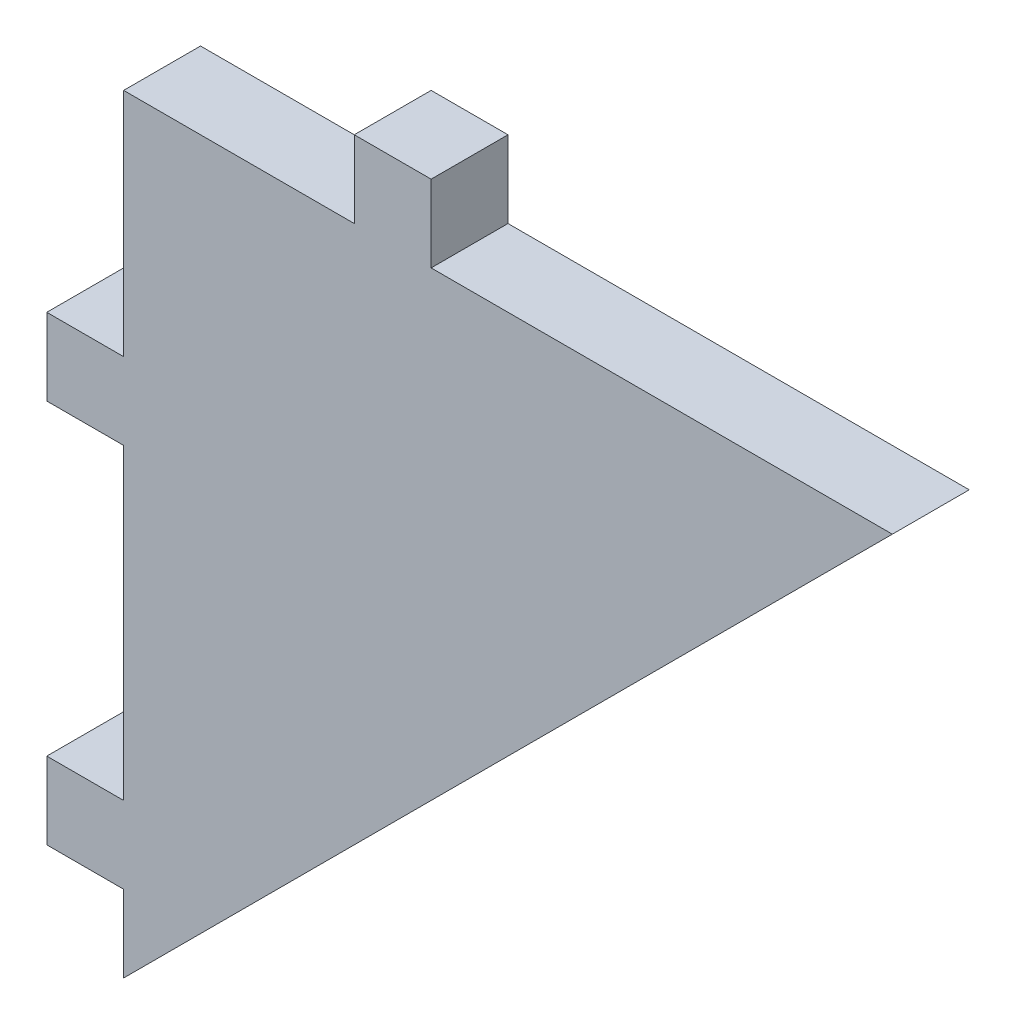
ISO-10303-21;
HEADER;
FILE_DESCRIPTION(('STEP AP214'),'2;1');
FILE_NAME('part.step','',(''),(''),'','','');
FILE_SCHEMA(('AUTOMOTIVE_DESIGN { 1 0 10303 214 1 1 1 1 }'));
ENDSEC;
DATA;
#1=APPLICATION_CONTEXT('core data for automotive mechanical design processes');
#2=APPLICATION_PROTOCOL_DEFINITION('international standard','automotive_design',2000,#1);
#3=PRODUCT_CONTEXT('',#1,'mechanical');
#4=PRODUCT('Part','Part','',(#3));
#5=PRODUCT_RELATED_PRODUCT_CATEGORY('part','',(#4));
#6=PRODUCT_DEFINITION_FORMATION('','',#4);
#7=PRODUCT_DEFINITION_CONTEXT('part definition',#1,'design');
#8=PRODUCT_DEFINITION('design','',#6,#7);
#9=PRODUCT_DEFINITION_SHAPE('','',#8);
#10=(LENGTH_UNIT() NAMED_UNIT(*) SI_UNIT(.MILLI.,.METRE.));
#11=(NAMED_UNIT(*) PLANE_ANGLE_UNIT() SI_UNIT($,.RADIAN.));
#12=(NAMED_UNIT(*) SI_UNIT($,.STERADIAN.) SOLID_ANGLE_UNIT());
#13=UNCERTAINTY_MEASURE_WITH_UNIT(LENGTH_MEASURE(1.E-05),#10,'distance_accuracy_value','');
#14=(GEOMETRIC_REPRESENTATION_CONTEXT(3) GLOBAL_UNCERTAINTY_ASSIGNED_CONTEXT((#13)) GLOBAL_UNIT_ASSIGNED_CONTEXT((#10,
#11,#12)) REPRESENTATION_CONTEXT('',''));
#15=CARTESIAN_POINT('',(0.,0.,0.));
#16=DIRECTION('',(0.,0.,1.));
#17=DIRECTION('',(1.,0.,0.));
#18=AXIS2_PLACEMENT_3D('',#15,#16,#17);
#19=CARTESIAN_POINT('',(50.0000000000005,50.,5.));
#20=DIRECTION('',(-0.707106781186544,0.707106781186551,0.));
#21=DIRECTION('',(-0.707106781186551,-0.707106781186544,0.));
#22=AXIS2_PLACEMENT_3D('',#19,#20,#21);
#23=PLANE('',#22);
#24=DIRECTION('',(0.707106781186551,0.707106781186544,0.));
#25=VECTOR('',#24,1.);
#26=CARTESIAN_POINT('',(50.0000000000005,50.,0.));
#27=LINE('',#26,#25);
#28=CARTESIAN_POINT('',(0.,0.,0.));
#29=VERTEX_POINT('',#28);
#30=CARTESIAN_POINT('',(50.0000000000005,50.,0.));
#31=VERTEX_POINT('',#30);
#32=EDGE_CURVE('E169',#29,#31,#27,.T.);
#33=ORIENTED_EDGE('',*,*,#32,.T.);
#34=DIRECTION('',(0.,0.,-1.));
#35=VECTOR('',#34,1.);
#36=CARTESIAN_POINT('',(50.0000000000005,50.,5.));
#37=LINE('',#36,#35);
#38=CARTESIAN_POINT('',(50.0000000000005,50.,5.));
#39=VERTEX_POINT('',#38);
#40=EDGE_CURVE('E11',#39,#31,#37,.T.);
#41=ORIENTED_EDGE('',*,*,#40,.F.);
#42=DIRECTION('',(0.707106781186551,0.707106781186544,0.));
#43=VECTOR('',#42,1.);
#44=CARTESIAN_POINT('',(50.0000000000005,50.,5.));
#45=LINE('',#44,#43);
#46=CARTESIAN_POINT('',(0.,0.,5.));
#47=VERTEX_POINT('',#46);
#48=EDGE_CURVE('E197',#47,#39,#45,.T.);
#49=ORIENTED_EDGE('',*,*,#48,.F.);
#50=DIRECTION('',(0.,0.,-1.));
#51=VECTOR('',#50,1.);
#52=CARTESIAN_POINT('',(0.,0.,5.));
#53=LINE('',#52,#51);
#54=EDGE_CURVE('E165',#47,#29,#53,.T.);
#55=ORIENTED_EDGE('',*,*,#54,.T.);
#56=EDGE_LOOP('',(#33,#41,#49,#55));
#57=FACE_BOUND('',#56,.T.);
#58=ADVANCED_FACE('F31',(#57),#23,.F.);
#59=CARTESIAN_POINT('',(20.,50.,5.));
#60=DIRECTION('',(0.,-1.,0.));
#61=DIRECTION('',(0.,0.,-1.));
#62=AXIS2_PLACEMENT_3D('',#59,#60,#61);
#63=PLANE('',#62);
#64=DIRECTION('',(-1.,0.,0.));
#65=VECTOR('',#64,1.);
#66=CARTESIAN_POINT('',(20.,50.,0.));
#67=LINE('',#66,#65);
#68=CARTESIAN_POINT('',(20.,50.,0.));
#69=VERTEX_POINT('',#68);
#70=EDGE_CURVE('E172',#31,#69,#67,.T.);
#71=ORIENTED_EDGE('',*,*,#70,.T.);
#72=DIRECTION('',(0.,0.,-1.));
#73=VECTOR('',#72,1.);
#74=CARTESIAN_POINT('',(20.,50.,5.));
#75=LINE('',#74,#73);
#76=CARTESIAN_POINT('',(20.,50.,5.));
#77=VERTEX_POINT('',#76);
#78=EDGE_CURVE('E39',#77,#69,#75,.T.);
#79=ORIENTED_EDGE('',*,*,#78,.F.);
#80=DIRECTION('',(-1.,0.,0.));
#81=VECTOR('',#80,1.);
#82=CARTESIAN_POINT('',(20.,50.,5.));
#83=LINE('',#82,#81);
#84=EDGE_CURVE('E111',#39,#77,#83,.T.);
#85=ORIENTED_EDGE('',*,*,#84,.F.);
#86=ORIENTED_EDGE('',*,*,#40,.T.);
#87=EDGE_LOOP('',(#71,#79,#85,#86));
#88=FACE_BOUND('',#87,.T.);
#89=ADVANCED_FACE('F290',(#88),#63,.F.);
#90=CARTESIAN_POINT('',(20.,55.,5.));
#91=DIRECTION('',(-1.,0.,0.));
#92=DIRECTION('',(0.,0.,1.));
#93=AXIS2_PLACEMENT_3D('',#90,#91,#92);
#94=PLANE('',#93);
#95=DIRECTION('',(0.,1.,0.));
#96=VECTOR('',#95,1.);
#97=CARTESIAN_POINT('',(20.,55.,0.));
#98=LINE('',#97,#96);
#99=CARTESIAN_POINT('',(20.,55.,0.));
#100=VERTEX_POINT('',#99);
#101=EDGE_CURVE('E174',#69,#100,#98,.T.);
#102=ORIENTED_EDGE('',*,*,#101,.T.);
#103=DIRECTION('',(0.,0.,-1.));
#104=VECTOR('',#103,1.);
#105=CARTESIAN_POINT('',(20.,55.,5.));
#106=LINE('',#105,#104);
#107=CARTESIAN_POINT('',(20.,55.,5.));
#108=VERTEX_POINT('',#107);
#109=EDGE_CURVE('E225',#108,#100,#106,.T.);
#110=ORIENTED_EDGE('',*,*,#109,.F.);
#111=DIRECTION('',(0.,1.,0.));
#112=VECTOR('',#111,1.);
#113=CARTESIAN_POINT('',(20.,55.,5.));
#114=LINE('',#113,#112);
#115=EDGE_CURVE('E233',#77,#108,#114,.T.);
#116=ORIENTED_EDGE('',*,*,#115,.F.);
#117=ORIENTED_EDGE('',*,*,#78,.T.);
#118=EDGE_LOOP('',(#102,#110,#116,#117));
#119=FACE_BOUND('',#118,.T.);
#120=ADVANCED_FACE('F231',(#119),#94,.F.);
#121=CARTESIAN_POINT('',(15.,55.,5.));
#122=DIRECTION('',(0.,-1.,0.));
#123=DIRECTION('',(0.,0.,-1.));
#124=AXIS2_PLACEMENT_3D('',#121,#122,#123);
#125=PLANE('',#124);
#126=DIRECTION('',(-1.,0.,0.));
#127=VECTOR('',#126,1.);
#128=CARTESIAN_POINT('',(15.,55.,0.));
#129=LINE('',#128,#127);
#130=CARTESIAN_POINT('',(15.,55.,0.));
#131=VERTEX_POINT('',#130);
#132=EDGE_CURVE('E176',#100,#131,#129,.T.);
#133=ORIENTED_EDGE('',*,*,#132,.T.);
#134=DIRECTION('',(0.,0.,-1.));
#135=VECTOR('',#134,1.);
#136=CARTESIAN_POINT('',(15.,55.,5.));
#137=LINE('',#136,#135);
#138=CARTESIAN_POINT('',(15.,55.,5.));
#139=VERTEX_POINT('',#138);
#140=EDGE_CURVE('E222',#139,#131,#137,.T.);
#141=ORIENTED_EDGE('',*,*,#140,.F.);
#142=DIRECTION('',(-1.,0.,0.));
#143=VECTOR('',#142,1.);
#144=CARTESIAN_POINT('',(15.,55.,5.));
#145=LINE('',#144,#143);
#146=EDGE_CURVE('E251',#108,#139,#145,.T.);
#147=ORIENTED_EDGE('',*,*,#146,.F.);
#148=ORIENTED_EDGE('',*,*,#109,.T.);
#149=EDGE_LOOP('',(#133,#141,#147,#148));
#150=FACE_BOUND('',#149,.T.);
#151=ADVANCED_FACE('F242',(#150),#125,.F.);
#152=CARTESIAN_POINT('',(15.,50.,5.));
#153=DIRECTION('',(1.,0.,0.));
#154=DIRECTION('',(0.,0.,-1.));
#155=AXIS2_PLACEMENT_3D('',#152,#153,#154);
#156=PLANE('',#155);
#157=DIRECTION('',(0.,-1.,0.));
#158=VECTOR('',#157,1.);
#159=CARTESIAN_POINT('',(15.,50.,0.));
#160=LINE('',#159,#158);
#161=CARTESIAN_POINT('',(15.,50.,0.));
#162=VERTEX_POINT('',#161);
#163=EDGE_CURVE('E178',#131,#162,#160,.T.);
#164=ORIENTED_EDGE('',*,*,#163,.T.);
#165=DIRECTION('',(0.,0.,-1.));
#166=VECTOR('',#165,1.);
#167=CARTESIAN_POINT('',(15.,50.,5.));
#168=LINE('',#167,#166);
#169=CARTESIAN_POINT('',(15.,50.,5.));
#170=VERTEX_POINT('',#169);
#171=EDGE_CURVE('E219',#170,#162,#168,.T.);
#172=ORIENTED_EDGE('',*,*,#171,.F.);
#173=DIRECTION('',(0.,-1.,0.));
#174=VECTOR('',#173,1.);
#175=CARTESIAN_POINT('',(15.,50.,5.));
#176=LINE('',#175,#174);
#177=EDGE_CURVE('E248',#139,#170,#176,.T.);
#178=ORIENTED_EDGE('',*,*,#177,.F.);
#179=ORIENTED_EDGE('',*,*,#140,.T.);
#180=EDGE_LOOP('',(#164,#172,#178,#179));
#181=FACE_BOUND('',#180,.T.);
#182=ADVANCED_FACE('F246',(#181),#156,.F.);
#183=CARTESIAN_POINT('',(0.,50.,5.));
#184=DIRECTION('',(0.,-1.,0.));
#185=DIRECTION('',(0.,0.,-1.));
#186=AXIS2_PLACEMENT_3D('',#183,#184,#185);
#187=PLANE('',#186);
#188=DIRECTION('',(-1.,0.,0.));
#189=VECTOR('',#188,1.);
#190=CARTESIAN_POINT('',(0.,50.,0.));
#191=LINE('',#190,#189);
#192=CARTESIAN_POINT('',(0.,50.,0.));
#193=VERTEX_POINT('',#192);
#194=EDGE_CURVE('E180',#162,#193,#191,.T.);
#195=ORIENTED_EDGE('',*,*,#194,.T.);
#196=DIRECTION('',(0.,0.,-1.));
#197=VECTOR('',#196,1.);
#198=CARTESIAN_POINT('',(0.,50.,5.));
#199=LINE('',#198,#197);
#200=CARTESIAN_POINT('',(0.,50.,5.));
#201=VERTEX_POINT('',#200);
#202=EDGE_CURVE('E216',#201,#193,#199,.T.);
#203=ORIENTED_EDGE('',*,*,#202,.F.);
#204=DIRECTION('',(-1.,0.,0.));
#205=VECTOR('',#204,1.);
#206=CARTESIAN_POINT('',(0.,50.,5.));
#207=LINE('',#206,#205);
#208=EDGE_CURVE('E250',#170,#201,#207,.T.);
#209=ORIENTED_EDGE('',*,*,#208,.F.);
#210=ORIENTED_EDGE('',*,*,#171,.T.);
#211=EDGE_LOOP('',(#195,#203,#209,#210));
#212=FACE_BOUND('',#211,.T.);
#213=ADVANCED_FACE('F303',(#212),#187,.F.);
#214=CARTESIAN_POINT('',(0.,35.,5.));
#215=DIRECTION('',(1.,0.,0.));
#216=DIRECTION('',(0.,0.,-1.));
#217=AXIS2_PLACEMENT_3D('',#214,#215,#216);
#218=PLANE('',#217);
#219=DIRECTION('',(0.,-1.,0.));
#220=VECTOR('',#219,1.);
#221=CARTESIAN_POINT('',(0.,35.,0.));
#222=LINE('',#221,#220);
#223=CARTESIAN_POINT('',(0.,35.,0.));
#224=VERTEX_POINT('',#223);
#225=EDGE_CURVE('E182',#193,#224,#222,.T.);
#226=ORIENTED_EDGE('',*,*,#225,.T.);
#227=DIRECTION('',(0.,0.,-1.));
#228=VECTOR('',#227,1.);
#229=CARTESIAN_POINT('',(0.,35.,5.));
#230=LINE('',#229,#228);
#231=CARTESIAN_POINT('',(0.,35.,5.));
#232=VERTEX_POINT('',#231);
#233=EDGE_CURVE('E213',#232,#224,#230,.T.);
#234=ORIENTED_EDGE('',*,*,#233,.F.);
#235=DIRECTION('',(0.,-1.,0.));
#236=VECTOR('',#235,1.);
#237=CARTESIAN_POINT('',(0.,35.,5.));
#238=LINE('',#237,#236);
#239=EDGE_CURVE('E253',#201,#232,#238,.T.);
#240=ORIENTED_EDGE('',*,*,#239,.F.);
#241=ORIENTED_EDGE('',*,*,#202,.T.);
#242=EDGE_LOOP('',(#226,#234,#240,#241));
#243=FACE_BOUND('',#242,.T.);
#244=ADVANCED_FACE('F306',(#243),#218,.F.);
#245=CARTESIAN_POINT('',(-5.,35.,5.));
#246=DIRECTION('',(0.,-1.,0.));
#247=DIRECTION('',(0.,0.,-1.));
#248=AXIS2_PLACEMENT_3D('',#245,#246,#247);
#249=PLANE('',#248);
#250=DIRECTION('',(-1.,0.,0.));
#251=VECTOR('',#250,1.);
#252=CARTESIAN_POINT('',(-5.,35.,0.));
#253=LINE('',#252,#251);
#254=CARTESIAN_POINT('',(-5.,35.,0.));
#255=VERTEX_POINT('',#254);
#256=EDGE_CURVE('E184',#224,#255,#253,.T.);
#257=ORIENTED_EDGE('',*,*,#256,.T.);
#258=DIRECTION('',(0.,0.,-1.));
#259=VECTOR('',#258,1.);
#260=CARTESIAN_POINT('',(-5.,35.,5.));
#261=LINE('',#260,#259);
#262=CARTESIAN_POINT('',(-5.,35.,5.));
#263=VERTEX_POINT('',#262);
#264=EDGE_CURVE('E210',#263,#255,#261,.T.);
#265=ORIENTED_EDGE('',*,*,#264,.F.);
#266=DIRECTION('',(-1.,0.,0.));
#267=VECTOR('',#266,1.);
#268=CARTESIAN_POINT('',(-5.,35.,5.));
#269=LINE('',#268,#267);
#270=EDGE_CURVE('E259',#232,#263,#269,.T.);
#271=ORIENTED_EDGE('',*,*,#270,.F.);
#272=ORIENTED_EDGE('',*,*,#233,.T.);
#273=EDGE_LOOP('',(#257,#265,#271,#272));
#274=FACE_BOUND('',#273,.T.);
#275=ADVANCED_FACE('F310',(#274),#249,.F.);
#276=CARTESIAN_POINT('',(-5.,30.,5.));
#277=DIRECTION('',(1.,0.,0.));
#278=DIRECTION('',(0.,0.,-1.));
#279=AXIS2_PLACEMENT_3D('',#276,#277,#278);
#280=PLANE('',#279);
#281=DIRECTION('',(0.,-1.,0.));
#282=VECTOR('',#281,1.);
#283=CARTESIAN_POINT('',(-5.,30.,0.));
#284=LINE('',#283,#282);
#285=CARTESIAN_POINT('',(-5.,30.,0.));
#286=VERTEX_POINT('',#285);
#287=EDGE_CURVE('E186',#255,#286,#284,.T.);
#288=ORIENTED_EDGE('',*,*,#287,.T.);
#289=DIRECTION('',(0.,0.,-1.));
#290=VECTOR('',#289,1.);
#291=CARTESIAN_POINT('',(-5.,30.,5.));
#292=LINE('',#291,#290);
#293=CARTESIAN_POINT('',(-5.,30.,5.));
#294=VERTEX_POINT('',#293);
#295=EDGE_CURVE('E207',#294,#286,#292,.T.);
#296=ORIENTED_EDGE('',*,*,#295,.F.);
#297=DIRECTION('',(0.,-1.,0.));
#298=VECTOR('',#297,1.);
#299=CARTESIAN_POINT('',(-5.,30.,5.));
#300=LINE('',#299,#298);
#301=EDGE_CURVE('E261',#263,#294,#300,.T.);
#302=ORIENTED_EDGE('',*,*,#301,.F.);
#303=ORIENTED_EDGE('',*,*,#264,.T.);
#304=EDGE_LOOP('',(#288,#296,#302,#303));
#305=FACE_BOUND('',#304,.T.);
#306=ADVANCED_FACE('F314',(#305),#280,.F.);
#307=CARTESIAN_POINT('',(0.,30.,5.));
#308=DIRECTION('',(0.,1.,0.));
#309=DIRECTION('',(-1.,0.,0.));
#310=AXIS2_PLACEMENT_3D('',#307,#308,#309);
#311=PLANE('',#310);
#312=DIRECTION('',(1.,0.,0.));
#313=VECTOR('',#312,1.);
#314=CARTESIAN_POINT('',(0.,30.,0.));
#315=LINE('',#314,#313);
#316=CARTESIAN_POINT('',(0.,30.,0.));
#317=VERTEX_POINT('',#316);
#318=EDGE_CURVE('E188',#286,#317,#315,.T.);
#319=ORIENTED_EDGE('',*,*,#318,.T.);
#320=DIRECTION('',(0.,0.,-1.));
#321=VECTOR('',#320,1.);
#322=CARTESIAN_POINT('',(0.,30.,5.));
#323=LINE('',#322,#321);
#324=CARTESIAN_POINT('',(0.,30.,5.));
#325=VERTEX_POINT('',#324);
#326=EDGE_CURVE('E204',#325,#317,#323,.T.);
#327=ORIENTED_EDGE('',*,*,#326,.F.);
#328=DIRECTION('',(1.,0.,0.));
#329=VECTOR('',#328,1.);
#330=CARTESIAN_POINT('',(0.,30.,5.));
#331=LINE('',#330,#329);
#332=EDGE_CURVE('E263',#294,#325,#331,.T.);
#333=ORIENTED_EDGE('',*,*,#332,.F.);
#334=ORIENTED_EDGE('',*,*,#295,.T.);
#335=EDGE_LOOP('',(#319,#327,#333,#334));
#336=FACE_BOUND('',#335,.T.);
#337=ADVANCED_FACE('F318',(#336),#311,.F.);
#338=CARTESIAN_POINT('',(0.,10.,5.));
#339=DIRECTION('',(1.,0.,0.));
#340=DIRECTION('',(0.,0.,-1.));
#341=AXIS2_PLACEMENT_3D('',#338,#339,#340);
#342=PLANE('',#341);
#343=DIRECTION('',(0.,-1.,0.));
#344=VECTOR('',#343,1.);
#345=CARTESIAN_POINT('',(0.,10.,0.));
#346=LINE('',#345,#344);
#347=CARTESIAN_POINT('',(0.,10.,0.));
#348=VERTEX_POINT('',#347);
#349=EDGE_CURVE('E190',#317,#348,#346,.T.);
#350=ORIENTED_EDGE('',*,*,#349,.T.);
#351=DIRECTION('',(0.,0.,-1.));
#352=VECTOR('',#351,1.);
#353=CARTESIAN_POINT('',(0.,10.,5.));
#354=LINE('',#353,#352);
#355=CARTESIAN_POINT('',(0.,10.,5.));
#356=VERTEX_POINT('',#355);
#357=EDGE_CURVE('E201',#356,#348,#354,.T.);
#358=ORIENTED_EDGE('',*,*,#357,.F.);
#359=DIRECTION('',(0.,-1.,0.));
#360=VECTOR('',#359,1.);
#361=CARTESIAN_POINT('',(0.,10.,5.));
#362=LINE('',#361,#360);
#363=EDGE_CURVE('E265',#325,#356,#362,.T.);
#364=ORIENTED_EDGE('',*,*,#363,.F.);
#365=ORIENTED_EDGE('',*,*,#326,.T.);
#366=EDGE_LOOP('',(#350,#358,#364,#365));
#367=FACE_BOUND('',#366,.T.);
#368=ADVANCED_FACE('F271',(#367),#342,.F.);
#369=CARTESIAN_POINT('',(-5.,9.99999999999998,5.));
#370=DIRECTION('',(0.,-1.,0.));
#371=DIRECTION('',(1.,0.,0.));
#372=AXIS2_PLACEMENT_3D('',#369,#370,#371);
#373=PLANE('',#372);
#374=DIRECTION('',(-1.,0.,0.));
#375=VECTOR('',#374,1.);
#376=CARTESIAN_POINT('',(-5.,9.99999999999998,0.));
#377=LINE('',#376,#375);
#378=CARTESIAN_POINT('',(-5.,9.99999999999998,0.));
#379=VERTEX_POINT('',#378);
#380=EDGE_CURVE('E192',#348,#379,#377,.T.);
#381=ORIENTED_EDGE('',*,*,#380,.T.);
#382=DIRECTION('',(0.,0.,-1.));
#383=VECTOR('',#382,1.);
#384=CARTESIAN_POINT('',(-5.,9.99999999999998,5.));
#385=LINE('',#384,#383);
#386=CARTESIAN_POINT('',(-5.,9.99999999999998,5.));
#387=VERTEX_POINT('',#386);
#388=EDGE_CURVE('E160',#387,#379,#385,.T.);
#389=ORIENTED_EDGE('',*,*,#388,.F.);
#390=DIRECTION('',(-1.,0.,0.));
#391=VECTOR('',#390,1.);
#392=CARTESIAN_POINT('',(-5.,9.99999999999998,5.));
#393=LINE('',#392,#391);
#394=EDGE_CURVE('E151',#356,#387,#393,.T.);
#395=ORIENTED_EDGE('',*,*,#394,.F.);
#396=ORIENTED_EDGE('',*,*,#357,.T.);
#397=EDGE_LOOP('',(#381,#389,#395,#396));
#398=FACE_BOUND('',#397,.T.);
#399=ADVANCED_FACE('F275',(#398),#373,.F.);
#400=CARTESIAN_POINT('',(-5.,5.,5.));
#401=DIRECTION('',(1.,0.,0.));
#402=DIRECTION('',(0.,0.,-1.));
#403=AXIS2_PLACEMENT_3D('',#400,#401,#402);
#404=PLANE('',#403);
#405=DIRECTION('',(0.,-1.,0.));
#406=VECTOR('',#405,1.);
#407=CARTESIAN_POINT('',(-5.,5.,0.));
#408=LINE('',#407,#406);
#409=CARTESIAN_POINT('',(-5.,5.,0.));
#410=VERTEX_POINT('',#409);
#411=EDGE_CURVE('E159',#379,#410,#408,.T.);
#412=ORIENTED_EDGE('',*,*,#411,.T.);
#413=DIRECTION('',(0.,0.,-1.));
#414=VECTOR('',#413,1.);
#415=CARTESIAN_POINT('',(-5.,5.,5.));
#416=LINE('',#415,#414);
#417=CARTESIAN_POINT('',(-5.,5.,5.));
#418=VERTEX_POINT('',#417);
#419=EDGE_CURVE('E156',#418,#410,#416,.T.);
#420=ORIENTED_EDGE('',*,*,#419,.F.);
#421=DIRECTION('',(0.,-1.,0.));
#422=VECTOR('',#421,1.);
#423=CARTESIAN_POINT('',(-5.,5.,5.));
#424=LINE('',#423,#422);
#425=EDGE_CURVE('E145',#387,#418,#424,.T.);
#426=ORIENTED_EDGE('',*,*,#425,.F.);
#427=ORIENTED_EDGE('',*,*,#388,.T.);
#428=EDGE_LOOP('',(#412,#420,#426,#427));
#429=FACE_BOUND('',#428,.T.);
#430=ADVANCED_FACE('F157',(#429),#404,.F.);
#431=CARTESIAN_POINT('',(0.,5.,5.));
#432=DIRECTION('',(0.,1.,0.));
#433=DIRECTION('',(0.,0.,1.));
#434=AXIS2_PLACEMENT_3D('',#431,#432,#433);
#435=PLANE('',#434);
#436=DIRECTION('',(1.,0.,0.));
#437=VECTOR('',#436,1.);
#438=CARTESIAN_POINT('',(0.,5.,0.));
#439=LINE('',#438,#437);
#440=CARTESIAN_POINT('',(0.,5.,0.));
#441=VERTEX_POINT('',#440);
#442=EDGE_CURVE('E97',#410,#441,#439,.T.);
#443=ORIENTED_EDGE('',*,*,#442,.T.);
#444=DIRECTION('',(0.,0.,-1.));
#445=VECTOR('',#444,1.);
#446=CARTESIAN_POINT('',(0.,5.,5.));
#447=LINE('',#446,#445);
#448=CARTESIAN_POINT('',(0.,5.,5.));
#449=VERTEX_POINT('',#448);
#450=EDGE_CURVE('E161',#449,#441,#447,.T.);
#451=ORIENTED_EDGE('',*,*,#450,.F.);
#452=DIRECTION('',(1.,0.,0.));
#453=VECTOR('',#452,1.);
#454=CARTESIAN_POINT('',(0.,5.,5.));
#455=LINE('',#454,#453);
#456=EDGE_CURVE('E149',#418,#449,#455,.T.);
#457=ORIENTED_EDGE('',*,*,#456,.F.);
#458=ORIENTED_EDGE('',*,*,#419,.T.);
#459=EDGE_LOOP('',(#443,#451,#457,#458));
#460=FACE_BOUND('',#459,.T.);
#461=ADVANCED_FACE('F163',(#460),#435,.F.);
#462=CARTESIAN_POINT('',(0.,0.,5.));
#463=DIRECTION('',(1.,0.,0.));
#464=DIRECTION('',(0.,0.,-1.));
#465=AXIS2_PLACEMENT_3D('',#462,#463,#464);
#466=PLANE('',#465);
#467=DIRECTION('',(0.,-1.,0.));
#468=VECTOR('',#467,1.);
#469=CARTESIAN_POINT('',(0.,0.,0.));
#470=LINE('',#469,#468);
#471=EDGE_CURVE('E103',#441,#29,#470,.T.);
#472=ORIENTED_EDGE('',*,*,#471,.T.);
#473=ORIENTED_EDGE('',*,*,#54,.F.);
#474=DIRECTION('',(0.,-1.,0.));
#475=VECTOR('',#474,1.);
#476=CARTESIAN_POINT('',(0.,0.,5.));
#477=LINE('',#476,#475);
#478=EDGE_CURVE('E47',#449,#47,#477,.T.);
#479=ORIENTED_EDGE('',*,*,#478,.F.);
#480=ORIENTED_EDGE('',*,*,#450,.T.);
#481=EDGE_LOOP('',(#472,#473,#479,#480));
#482=FACE_BOUND('',#481,.T.);
#483=ADVANCED_FACE('F279',(#482),#466,.F.);
#484=CARTESIAN_POINT('',(0.,0.,5.));
#485=DIRECTION('',(0.,0.,-1.));
#486=DIRECTION('',(-1.,0.,0.));
#487=AXIS2_PLACEMENT_3D('',#484,#485,#486);
#488=PLANE('',#487);
#489=ORIENTED_EDGE('',*,*,#48,.T.);
#490=ORIENTED_EDGE('',*,*,#84,.T.);
#491=ORIENTED_EDGE('',*,*,#115,.T.);
#492=ORIENTED_EDGE('',*,*,#146,.T.);
#493=ORIENTED_EDGE('',*,*,#177,.T.);
#494=ORIENTED_EDGE('',*,*,#208,.T.);
#495=ORIENTED_EDGE('',*,*,#239,.T.);
#496=ORIENTED_EDGE('',*,*,#270,.T.);
#497=ORIENTED_EDGE('',*,*,#301,.T.);
#498=ORIENTED_EDGE('',*,*,#332,.T.);
#499=ORIENTED_EDGE('',*,*,#363,.T.);
#500=ORIENTED_EDGE('',*,*,#394,.T.);
#501=ORIENTED_EDGE('',*,*,#425,.T.);
#502=ORIENTED_EDGE('',*,*,#456,.T.);
#503=ORIENTED_EDGE('',*,*,#478,.T.);
#504=EDGE_LOOP('',(#489,#490,#491,#492,#493,#494,#495,#496,#497,#498,#499,#500,#501,#502,#503));
#505=FACE_BOUND('',#504,.T.);
#506=ADVANCED_FACE('F147',(#505),#488,.F.);
#507=CARTESIAN_POINT('',(0.,0.,0.));
#508=DIRECTION('',(0.,0.,-1.));
#509=DIRECTION('',(-1.,0.,0.));
#510=AXIS2_PLACEMENT_3D('',#507,#508,#509);
#511=PLANE('',#510);
#512=ORIENTED_EDGE('',*,*,#32,.F.);
#513=ORIENTED_EDGE('',*,*,#471,.F.);
#514=ORIENTED_EDGE('',*,*,#442,.F.);
#515=ORIENTED_EDGE('',*,*,#411,.F.);
#516=ORIENTED_EDGE('',*,*,#380,.F.);
#517=ORIENTED_EDGE('',*,*,#349,.F.);
#518=ORIENTED_EDGE('',*,*,#318,.F.);
#519=ORIENTED_EDGE('',*,*,#287,.F.);
#520=ORIENTED_EDGE('',*,*,#256,.F.);
#521=ORIENTED_EDGE('',*,*,#225,.F.);
#522=ORIENTED_EDGE('',*,*,#194,.F.);
#523=ORIENTED_EDGE('',*,*,#163,.F.);
#524=ORIENTED_EDGE('',*,*,#132,.F.);
#525=ORIENTED_EDGE('',*,*,#101,.F.);
#526=ORIENTED_EDGE('',*,*,#70,.F.);
#527=EDGE_LOOP('',(#512,#513,#514,#515,#516,#517,#518,#519,#520,#521,#522,#523,#524,#525,#526));
#528=FACE_BOUND('',#527,.T.);
#529=ADVANCED_FACE('F237',(#528),#511,.T.);
#530=CLOSED_SHELL('',(#58,#89,#120,#151,#182,#213,#244,#275,#306,#337,#368,#399,#430,#461,#483,
#506,#529));
#531=MANIFOLD_SOLID_BREP('B2',#530);
#532=ADVANCED_BREP_SHAPE_REPRESENTATION('',(#18,#531),#14);
#533=SHAPE_DEFINITION_REPRESENTATION(#9,#532);
ENDSEC;
END-ISO-10303-21;
